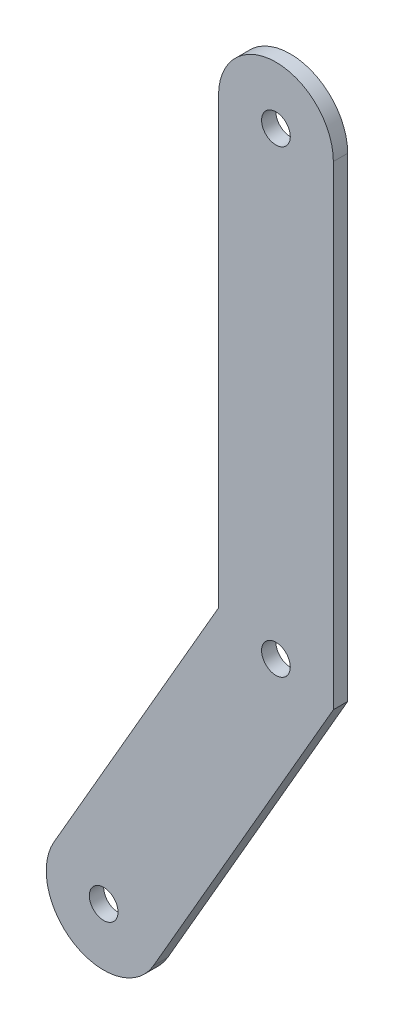
ISO-10303-21;
HEADER;
FILE_DESCRIPTION(('STEP AP214'),'2;1');
FILE_NAME('part.step','',(''),(''),'','','');
FILE_SCHEMA(('AUTOMOTIVE_DESIGN { 1 0 10303 214 1 1 1 1 }'));
ENDSEC;
DATA;
#1=APPLICATION_CONTEXT('core data for automotive mechanical design processes');
#2=APPLICATION_PROTOCOL_DEFINITION('international standard','automotive_design',2000,#1);
#3=PRODUCT_CONTEXT('',#1,'mechanical');
#4=PRODUCT('Part','Part','',(#3));
#5=PRODUCT_RELATED_PRODUCT_CATEGORY('part','',(#4));
#6=PRODUCT_DEFINITION_FORMATION('','',#4);
#7=PRODUCT_DEFINITION_CONTEXT('part definition',#1,'design');
#8=PRODUCT_DEFINITION('design','',#6,#7);
#9=PRODUCT_DEFINITION_SHAPE('','',#8);
#10=(LENGTH_UNIT() NAMED_UNIT(*) SI_UNIT(.MILLI.,.METRE.));
#11=(NAMED_UNIT(*) PLANE_ANGLE_UNIT() SI_UNIT($,.RADIAN.));
#12=(NAMED_UNIT(*) SI_UNIT($,.STERADIAN.) SOLID_ANGLE_UNIT());
#13=UNCERTAINTY_MEASURE_WITH_UNIT(LENGTH_MEASURE(1.E-05),#10,'distance_accuracy_value','');
#14=(GEOMETRIC_REPRESENTATION_CONTEXT(3) GLOBAL_UNCERTAINTY_ASSIGNED_CONTEXT((#13)) GLOBAL_UNIT_ASSIGNED_CONTEXT((#10,
#11,#12)) REPRESENTATION_CONTEXT('',''));
#15=CARTESIAN_POINT('',(0.,0.,0.));
#16=DIRECTION('',(0.,0.,1.));
#17=DIRECTION('',(1.,0.,0.));
#18=AXIS2_PLACEMENT_3D('',#15,#16,#17);
#19=CARTESIAN_POINT('',(-152.4,-670.364543073497,12.7));
#20=DIRECTION('',(0.,0.,1.));
#21=DIRECTION('',(1.,0.,0.));
#22=AXIS2_PLACEMENT_3D('',#19,#20,#21);
#23=PLANE('',#22);
#24=CARTESIAN_POINT('',(0.,0.,12.7));
#25=DIRECTION('',(0.,0.,1.));
#26=DIRECTION('',(1.,0.,0.));
#27=AXIS2_PLACEMENT_3D('',#24,#25,#26);
#28=CIRCLE('',#27,12.7);
#29=CARTESIAN_POINT('',(12.7,0.,12.7));
#30=VERTEX_POINT('',#29);
#31=EDGE_CURVE('E190',#30,#30,#28,.T.);
#32=ORIENTED_EDGE('',*,*,#31,.F.);
#33=EDGE_LOOP('',(#32));
#34=FACE_BOUND('',#33,.T.);
#35=CARTESIAN_POINT('',(-152.4,-670.364543073497,12.7));
#36=DIRECTION('',(0.,0.,1.));
#37=DIRECTION('',(1.,0.,0.));
#38=AXIS2_PLACEMENT_3D('',#35,#36,#37);
#39=CIRCLE('',#38,50.8);
#40=CARTESIAN_POINT('',(-196.39409051225,-644.964543073497,12.7));
#41=VERTEX_POINT('',#40);
#42=CARTESIAN_POINT('',(-108.405909487751,-695.764543073497,12.7));
#43=VERTEX_POINT('',#42);
#44=EDGE_CURVE('E135',#41,#43,#39,.T.);
#45=ORIENTED_EDGE('',*,*,#44,.T.);
#46=DIRECTION('',(0.500000000000001,0.866025403784438,0.));
#47=VECTOR('',#46,1.);
#48=CARTESIAN_POINT('',(-108.405909487751,-695.764543073497,12.7));
#49=LINE('',#48,#47);
#50=CARTESIAN_POINT('',(50.8,-420.011818975501,12.7));
#51=VERTEX_POINT('',#50);
#52=EDGE_CURVE('E93',#43,#51,#49,.T.);
#53=ORIENTED_EDGE('',*,*,#52,.T.);
#54=DIRECTION('',(0.,1.,0.));
#55=VECTOR('',#54,1.);
#56=CARTESIAN_POINT('',(50.8,-420.011818975501,12.7));
#57=LINE('',#56,#55);
#58=CARTESIAN_POINT('',(50.8,0.,12.7));
#59=VERTEX_POINT('',#58);
#60=EDGE_CURVE('E106',#51,#59,#57,.T.);
#61=ORIENTED_EDGE('',*,*,#60,.T.);
#62=CARTESIAN_POINT('',(0.,0.,12.7));
#63=DIRECTION('',(0.,0.,1.));
#64=DIRECTION('',(1.,0.,0.));
#65=AXIS2_PLACEMENT_3D('',#62,#63,#64);
#66=CIRCLE('',#65,50.8);
#67=CARTESIAN_POINT('',(-50.8,0.,12.7));
#68=VERTEX_POINT('',#67);
#69=EDGE_CURVE('E100',#59,#68,#66,.T.);
#70=ORIENTED_EDGE('',*,*,#69,.T.);
#71=DIRECTION('',(0.,-1.,0.));
#72=VECTOR('',#71,1.);
#73=CARTESIAN_POINT('',(-50.8,0.,12.7));
#74=LINE('',#73,#72);
#75=CARTESIAN_POINT('',(-50.7999999999999,-392.788181024499,12.7));
#76=VERTEX_POINT('',#75);
#77=EDGE_CURVE('E104',#68,#76,#74,.T.);
#78=ORIENTED_EDGE('',*,*,#77,.T.);
#79=DIRECTION('',(-0.500000000000001,-0.866025403784438,0.));
#80=VECTOR('',#79,1.);
#81=CARTESIAN_POINT('',(-50.7999999999999,-392.788181024499,12.7));
#82=LINE('',#81,#80);
#83=EDGE_CURVE('E56',#76,#41,#82,.T.);
#84=ORIENTED_EDGE('',*,*,#83,.T.);
#85=EDGE_LOOP('',(#45,#53,#61,#70,#78,#84));
#86=FACE_BOUND('',#85,.T.);
#87=CARTESIAN_POINT('',(-152.4,-670.364543073497,12.7));
#88=DIRECTION('',(0.,0.,1.));
#89=DIRECTION('',(1.,0.,0.));
#90=AXIS2_PLACEMENT_3D('',#87,#88,#89);
#91=CIRCLE('',#90,12.7000000000005);
#92=CARTESIAN_POINT('',(-139.7,-670.364543073497,12.7));
#93=VERTEX_POINT('',#92);
#94=EDGE_CURVE('E128',#93,#93,#91,.T.);
#95=ORIENTED_EDGE('',*,*,#94,.F.);
#96=EDGE_LOOP('',(#95));
#97=FACE_BOUND('',#96,.T.);
#98=CARTESIAN_POINT('',(-1.73472347597681E-13,-406.4,12.7));
#99=DIRECTION('',(0.,0.,1.));
#100=DIRECTION('',(1.,0.,0.));
#101=AXIS2_PLACEMENT_3D('',#98,#99,#100);
#102=CIRCLE('',#101,12.7000000000002);
#103=CARTESIAN_POINT('',(12.7,-406.4,12.7));
#104=VERTEX_POINT('',#103);
#105=EDGE_CURVE('E181',#104,#104,#102,.T.);
#106=ORIENTED_EDGE('',*,*,#105,.F.);
#107=EDGE_LOOP('',(#106));
#108=FACE_BOUND('',#107,.T.);
#109=ADVANCED_FACE('F39',(#34,#86,#97,#108),#23,.T.);
#110=CARTESIAN_POINT('',(-152.4,-670.364543073497,0.));
#111=DIRECTION('',(0.,0.,1.));
#112=DIRECTION('',(1.,0.,0.));
#113=AXIS2_PLACEMENT_3D('',#110,#111,#112);
#114=PLANE('',#113);
#115=CARTESIAN_POINT('',(-152.4,-670.364543073497,0.));
#116=DIRECTION('',(0.,0.,1.));
#117=DIRECTION('',(1.,0.,0.));
#118=AXIS2_PLACEMENT_3D('',#115,#116,#117);
#119=CIRCLE('',#118,50.8);
#120=CARTESIAN_POINT('',(-196.39409051225,-644.964543073497,0.));
#121=VERTEX_POINT('',#120);
#122=CARTESIAN_POINT('',(-108.405909487751,-695.764543073497,0.));
#123=VERTEX_POINT('',#122);
#124=EDGE_CURVE('E124',#121,#123,#119,.T.);
#125=ORIENTED_EDGE('',*,*,#124,.F.);
#126=DIRECTION('',(-0.500000000000001,-0.866025403784438,0.));
#127=VECTOR('',#126,1.);
#128=CARTESIAN_POINT('',(-50.7999999999999,-392.788181024499,0.));
#129=LINE('',#128,#127);
#130=CARTESIAN_POINT('',(-50.7999999999999,-392.788181024499,0.));
#131=VERTEX_POINT('',#130);
#132=EDGE_CURVE('E85',#131,#121,#129,.T.);
#133=ORIENTED_EDGE('',*,*,#132,.F.);
#134=DIRECTION('',(0.,-1.,0.));
#135=VECTOR('',#134,1.);
#136=CARTESIAN_POINT('',(-50.8,0.,0.));
#137=LINE('',#136,#135);
#138=CARTESIAN_POINT('',(-50.8,0.,0.));
#139=VERTEX_POINT('',#138);
#140=EDGE_CURVE('E79',#139,#131,#137,.T.);
#141=ORIENTED_EDGE('',*,*,#140,.F.);
#142=CARTESIAN_POINT('',(0.,0.,0.));
#143=DIRECTION('',(0.,0.,1.));
#144=DIRECTION('',(1.,0.,0.));
#145=AXIS2_PLACEMENT_3D('',#142,#143,#144);
#146=CIRCLE('',#145,50.8);
#147=CARTESIAN_POINT('',(50.8,0.,0.));
#148=VERTEX_POINT('',#147);
#149=EDGE_CURVE('E114',#148,#139,#146,.T.);
#150=ORIENTED_EDGE('',*,*,#149,.F.);
#151=DIRECTION('',(0.,1.,0.));
#152=VECTOR('',#151,1.);
#153=CARTESIAN_POINT('',(50.8,-420.011818975501,0.));
#154=LINE('',#153,#152);
#155=CARTESIAN_POINT('',(50.8,-420.011818975501,0.));
#156=VERTEX_POINT('',#155);
#157=EDGE_CURVE('E130',#156,#148,#154,.T.);
#158=ORIENTED_EDGE('',*,*,#157,.F.);
#159=DIRECTION('',(0.500000000000001,0.866025403784438,0.));
#160=VECTOR('',#159,1.);
#161=CARTESIAN_POINT('',(-108.405909487751,-695.764543073497,0.));
#162=LINE('',#161,#160);
#163=EDGE_CURVE('E127',#123,#156,#162,.T.);
#164=ORIENTED_EDGE('',*,*,#163,.F.);
#165=EDGE_LOOP('',(#125,#133,#141,#150,#158,#164));
#166=FACE_BOUND('',#165,.T.);
#167=CARTESIAN_POINT('',(-152.4,-670.364543073497,0.));
#168=DIRECTION('',(0.,0.,1.));
#169=DIRECTION('',(1.,0.,0.));
#170=AXIS2_PLACEMENT_3D('',#167,#168,#169);
#171=CIRCLE('',#170,12.7000000000005);
#172=CARTESIAN_POINT('',(-139.7,-670.364543073497,0.));
#173=VERTEX_POINT('',#172);
#174=EDGE_CURVE('E193',#173,#173,#171,.T.);
#175=ORIENTED_EDGE('',*,*,#174,.T.);
#176=EDGE_LOOP('',(#175));
#177=FACE_BOUND('',#176,.T.);
#178=CARTESIAN_POINT('',(0.,0.,0.));
#179=DIRECTION('',(0.,0.,1.));
#180=DIRECTION('',(1.,0.,0.));
#181=AXIS2_PLACEMENT_3D('',#178,#179,#180);
#182=CIRCLE('',#181,12.7);
#183=CARTESIAN_POINT('',(12.7,0.,0.));
#184=VERTEX_POINT('',#183);
#185=EDGE_CURVE('E187',#184,#184,#182,.T.);
#186=ORIENTED_EDGE('',*,*,#185,.T.);
#187=EDGE_LOOP('',(#186));
#188=FACE_BOUND('',#187,.T.);
#189=CARTESIAN_POINT('',(-1.73472347597681E-13,-406.4,0.));
#190=DIRECTION('',(0.,0.,1.));
#191=DIRECTION('',(1.,0.,0.));
#192=AXIS2_PLACEMENT_3D('',#189,#190,#191);
#193=CIRCLE('',#192,12.7000000000002);
#194=CARTESIAN_POINT('',(12.7,-406.4,0.));
#195=VERTEX_POINT('',#194);
#196=EDGE_CURVE('E184',#195,#195,#193,.T.);
#197=ORIENTED_EDGE('',*,*,#196,.T.);
#198=EDGE_LOOP('',(#197));
#199=FACE_BOUND('',#198,.T.);
#200=ADVANCED_FACE('F144',(#166,#177,#188,#199),#114,.F.);
#201=CARTESIAN_POINT('',(-152.4,-670.364543073497,12.7));
#202=DIRECTION('',(0.,0.,-1.));
#203=DIRECTION('',(-1.,0.,0.));
#204=AXIS2_PLACEMENT_3D('',#201,#202,#203);
#205=CYLINDRICAL_SURFACE('',#204,50.8);
#206=ORIENTED_EDGE('',*,*,#124,.T.);
#207=DIRECTION('',(0.,0.,-1.));
#208=VECTOR('',#207,1.);
#209=CARTESIAN_POINT('',(-108.405909487751,-695.764543073497,12.7));
#210=LINE('',#209,#208);
#211=EDGE_CURVE('E11',#43,#123,#210,.T.);
#212=ORIENTED_EDGE('',*,*,#211,.F.);
#213=ORIENTED_EDGE('',*,*,#44,.F.);
#214=DIRECTION('',(0.,0.,-1.));
#215=VECTOR('',#214,1.);
#216=CARTESIAN_POINT('',(-196.39409051225,-644.964543073497,12.7));
#217=LINE('',#216,#215);
#218=EDGE_CURVE('E120',#41,#121,#217,.T.);
#219=ORIENTED_EDGE('',*,*,#218,.T.);
#220=EDGE_LOOP('',(#206,#212,#213,#219));
#221=FACE_BOUND('',#220,.T.);
#222=ADVANCED_FACE('F41',(#221),#205,.T.);
#223=CARTESIAN_POINT('',(-108.405909487751,-695.764543073497,12.7));
#224=DIRECTION('',(-0.866025403784438,0.500000000000001,0.));
#225=DIRECTION('',(-0.500000000000001,-0.866025403784438,0.));
#226=AXIS2_PLACEMENT_3D('',#223,#224,#225);
#227=PLANE('',#226);
#228=ORIENTED_EDGE('',*,*,#163,.T.);
#229=DIRECTION('',(0.,0.,-1.));
#230=VECTOR('',#229,1.);
#231=CARTESIAN_POINT('',(50.8,-420.011818975501,12.7));
#232=LINE('',#231,#230);
#233=EDGE_CURVE('E48',#51,#156,#232,.T.);
#234=ORIENTED_EDGE('',*,*,#233,.F.);
#235=ORIENTED_EDGE('',*,*,#52,.F.);
#236=ORIENTED_EDGE('',*,*,#211,.T.);
#237=EDGE_LOOP('',(#228,#234,#235,#236));
#238=FACE_BOUND('',#237,.T.);
#239=ADVANCED_FACE('F243',(#238),#227,.F.);
#240=CARTESIAN_POINT('',(50.8,-420.011818975501,12.7));
#241=DIRECTION('',(-1.,0.,0.));
#242=DIRECTION('',(0.,-1.,0.));
#243=AXIS2_PLACEMENT_3D('',#240,#241,#242);
#244=PLANE('',#243);
#245=ORIENTED_EDGE('',*,*,#157,.T.);
#246=DIRECTION('',(0.,0.,-1.));
#247=VECTOR('',#246,1.);
#248=CARTESIAN_POINT('',(50.8,0.,12.7));
#249=LINE('',#248,#247);
#250=EDGE_CURVE('E115',#59,#148,#249,.T.);
#251=ORIENTED_EDGE('',*,*,#250,.F.);
#252=ORIENTED_EDGE('',*,*,#60,.F.);
#253=ORIENTED_EDGE('',*,*,#233,.T.);
#254=EDGE_LOOP('',(#245,#251,#252,#253));
#255=FACE_BOUND('',#254,.T.);
#256=ADVANCED_FACE('F141',(#255),#244,.F.);
#257=CARTESIAN_POINT('',(0.,0.,12.7));
#258=DIRECTION('',(0.,0.,-1.));
#259=DIRECTION('',(-1.,0.,0.));
#260=AXIS2_PLACEMENT_3D('',#257,#258,#259);
#261=CYLINDRICAL_SURFACE('',#260,50.8);
#262=ORIENTED_EDGE('',*,*,#149,.T.);
#263=DIRECTION('',(0.,0.,-1.));
#264=VECTOR('',#263,1.);
#265=CARTESIAN_POINT('',(-50.8,0.,12.7));
#266=LINE('',#265,#264);
#267=EDGE_CURVE('E111',#68,#139,#266,.T.);
#268=ORIENTED_EDGE('',*,*,#267,.F.);
#269=ORIENTED_EDGE('',*,*,#69,.F.);
#270=ORIENTED_EDGE('',*,*,#250,.T.);
#271=EDGE_LOOP('',(#262,#268,#269,#270));
#272=FACE_BOUND('',#271,.T.);
#273=ADVANCED_FACE('F112',(#272),#261,.T.);
#274=CARTESIAN_POINT('',(-50.8,0.,12.7));
#275=DIRECTION('',(1.,0.,0.));
#276=DIRECTION('',(0.,1.,0.));
#277=AXIS2_PLACEMENT_3D('',#274,#275,#276);
#278=PLANE('',#277);
#279=ORIENTED_EDGE('',*,*,#140,.T.);
#280=DIRECTION('',(0.,0.,-1.));
#281=VECTOR('',#280,1.);
#282=CARTESIAN_POINT('',(-50.7999999999999,-392.788181024499,12.7));
#283=LINE('',#282,#281);
#284=EDGE_CURVE('E116',#76,#131,#283,.T.);
#285=ORIENTED_EDGE('',*,*,#284,.F.);
#286=ORIENTED_EDGE('',*,*,#77,.F.);
#287=ORIENTED_EDGE('',*,*,#267,.T.);
#288=EDGE_LOOP('',(#279,#285,#286,#287));
#289=FACE_BOUND('',#288,.T.);
#290=ADVANCED_FACE('F118',(#289),#278,.F.);
#291=CARTESIAN_POINT('',(-50.7999999999999,-392.788181024499,12.7));
#292=DIRECTION('',(0.866025403784438,-0.500000000000001,0.));
#293=DIRECTION('',(0.500000000000001,0.866025403784438,0.));
#294=AXIS2_PLACEMENT_3D('',#291,#292,#293);
#295=PLANE('',#294);
#296=ORIENTED_EDGE('',*,*,#132,.T.);
#297=ORIENTED_EDGE('',*,*,#218,.F.);
#298=ORIENTED_EDGE('',*,*,#83,.F.);
#299=ORIENTED_EDGE('',*,*,#284,.T.);
#300=EDGE_LOOP('',(#296,#297,#298,#299));
#301=FACE_BOUND('',#300,.T.);
#302=ADVANCED_FACE('F149',(#301),#295,.F.);
#303=CARTESIAN_POINT('',(-152.4,-670.364543073497,12.7));
#304=DIRECTION('',(0.,0.,-1.));
#305=DIRECTION('',(-1.,0.,0.));
#306=AXIS2_PLACEMENT_3D('',#303,#304,#305);
#307=CYLINDRICAL_SURFACE('',#306,12.7000000000005);
#308=ORIENTED_EDGE('',*,*,#94,.T.);
#309=EDGE_LOOP('',(#308));
#310=FACE_BOUND('',#309,.T.);
#311=ORIENTED_EDGE('',*,*,#174,.F.);
#312=EDGE_LOOP('',(#311));
#313=FACE_BOUND('',#312,.T.);
#314=ADVANCED_FACE('F151',(#310,#313),#307,.F.);
#315=CARTESIAN_POINT('',(0.,0.,12.7));
#316=DIRECTION('',(0.,0.,-1.));
#317=DIRECTION('',(-1.,0.,0.));
#318=AXIS2_PLACEMENT_3D('',#315,#316,#317);
#319=CYLINDRICAL_SURFACE('',#318,12.7);
#320=ORIENTED_EDGE('',*,*,#31,.T.);
#321=EDGE_LOOP('',(#320));
#322=FACE_BOUND('',#321,.T.);
#323=ORIENTED_EDGE('',*,*,#185,.F.);
#324=EDGE_LOOP('',(#323));
#325=FACE_BOUND('',#324,.T.);
#326=ADVANCED_FACE('F157',(#322,#325),#319,.F.);
#327=CARTESIAN_POINT('',(-1.73472347597681E-13,-406.4,12.7));
#328=DIRECTION('',(0.,0.,-1.));
#329=DIRECTION('',(-1.,0.,0.));
#330=AXIS2_PLACEMENT_3D('',#327,#328,#329);
#331=CYLINDRICAL_SURFACE('',#330,12.7000000000002);
#332=ORIENTED_EDGE('',*,*,#105,.T.);
#333=EDGE_LOOP('',(#332));
#334=FACE_BOUND('',#333,.T.);
#335=ORIENTED_EDGE('',*,*,#196,.F.);
#336=EDGE_LOOP('',(#335));
#337=FACE_BOUND('',#336,.T.);
#338=ADVANCED_FACE('F172',(#334,#337),#331,.F.);
#339=CLOSED_SHELL('',(#109,#200,#222,#239,#256,#273,#290,#302,#314,#326,#338));
#340=MANIFOLD_SOLID_BREP('B2',#339);
#341=ADVANCED_BREP_SHAPE_REPRESENTATION('',(#18,#340),#14);
#342=SHAPE_DEFINITION_REPRESENTATION(#9,#341);
ENDSEC;
END-ISO-10303-21;
